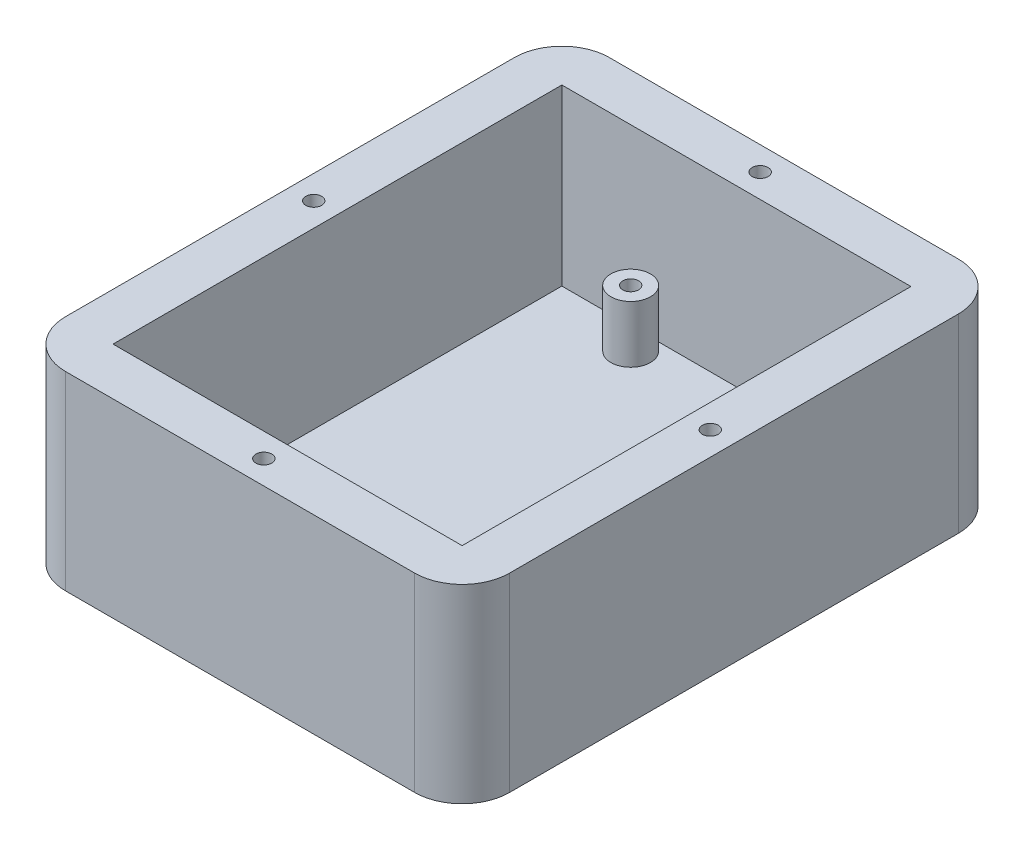
ISO-10303-21;
HEADER;
FILE_DESCRIPTION(('STEP AP214'),'2;1');
FILE_NAME('part.step','',(''),(''),'','','');
FILE_SCHEMA(('AUTOMOTIVE_DESIGN { 1 0 10303 214 1 1 1 1 }'));
ENDSEC;
DATA;
#1=APPLICATION_CONTEXT('core data for automotive mechanical design processes');
#2=APPLICATION_PROTOCOL_DEFINITION('international standard','automotive_design',2000,#1);
#3=PRODUCT_CONTEXT('',#1,'mechanical');
#4=PRODUCT('Part','Part','',(#3));
#5=PRODUCT_RELATED_PRODUCT_CATEGORY('part','',(#4));
#6=PRODUCT_DEFINITION_FORMATION('','',#4);
#7=PRODUCT_DEFINITION_CONTEXT('part definition',#1,'design');
#8=PRODUCT_DEFINITION('design','',#6,#7);
#9=PRODUCT_DEFINITION_SHAPE('','',#8);
#10=(LENGTH_UNIT() NAMED_UNIT(*) SI_UNIT(.MILLI.,.METRE.));
#11=(NAMED_UNIT(*) PLANE_ANGLE_UNIT() SI_UNIT($,.RADIAN.));
#12=(NAMED_UNIT(*) SI_UNIT($,.STERADIAN.) SOLID_ANGLE_UNIT());
#13=UNCERTAINTY_MEASURE_WITH_UNIT(LENGTH_MEASURE(1.E-05),#10,'distance_accuracy_value','');
#14=(GEOMETRIC_REPRESENTATION_CONTEXT(3) GLOBAL_UNCERTAINTY_ASSIGNED_CONTEXT((#13)) GLOBAL_UNIT_ASSIGNED_CONTEXT((#10,
#11,#12)) REPRESENTATION_CONTEXT('',''));
#15=CARTESIAN_POINT('',(0.,0.,0.));
#16=DIRECTION('',(0.,0.,1.));
#17=DIRECTION('',(1.,0.,0.));
#18=AXIS2_PLACEMENT_3D('',#15,#16,#17);
#19=CARTESIAN_POINT('',(3.175,38.1,-3.175));
#20=DIRECTION('',(0.,-1.,0.));
#21=DIRECTION('',(0.,0.,-1.));
#22=AXIS2_PLACEMENT_3D('',#19,#20,#21);
#23=PLANE('',#22);
#24=CARTESIAN_POINT('',(-1.5875,38.1,-48.175000043));
#25=DIRECTION('',(0.,1.,0.));
#26=DIRECTION('',(0.,0.,1.));
#27=AXIS2_PLACEMENT_3D('',#24,#25,#26);
#28=CIRCLE('',#27,1.5875);
#29=CARTESIAN_POINT('',(-1.5875,38.1,-46.587500043));
#30=VERTEX_POINT('',#29);
#31=EDGE_CURVE('E163',#30,#30,#28,.T.);
#32=ORIENTED_EDGE('',*,*,#31,.F.);
#33=EDGE_LOOP('',(#32));
#34=FACE_BOUND('',#33,.T.);
#35=CARTESIAN_POINT('',(38.174999977,38.1,-97.937500086));
#36=DIRECTION('',(0.,1.,0.));
#37=DIRECTION('',(0.,0.,1.));
#38=AXIS2_PLACEMENT_3D('',#35,#36,#37);
#39=CIRCLE('',#38,1.5875);
#40=CARTESIAN_POINT('',(38.174999977,38.1,-96.350000086));
#41=VERTEX_POINT('',#40);
#42=EDGE_CURVE('E589',#41,#41,#39,.T.);
#43=ORIENTED_EDGE('',*,*,#42,.F.);
#44=EDGE_LOOP('',(#43));
#45=FACE_BOUND('',#44,.T.);
#46=CARTESIAN_POINT('',(38.174999977,38.1,1.58750000000001));
#47=DIRECTION('',(0.,1.,0.));
#48=DIRECTION('',(0.,0.,-1.));
#49=AXIS2_PLACEMENT_3D('',#46,#47,#48);
#50=CIRCLE('',#49,1.5875);
#51=CARTESIAN_POINT('',(38.174999977,38.1,0.));
#52=VERTEX_POINT('',#51);
#53=EDGE_CURVE('E595',#52,#52,#50,.T.);
#54=ORIENTED_EDGE('',*,*,#53,.F.);
#55=EDGE_LOOP('',(#54));
#56=FACE_BOUND('',#55,.T.);
#57=CARTESIAN_POINT('',(77.937499954,38.1,-48.175000043));
#58=DIRECTION('',(0.,1.,0.));
#59=DIRECTION('',(0.,0.,-1.));
#60=AXIS2_PLACEMENT_3D('',#57,#58,#59);
#61=CIRCLE('',#60,1.5875);
#62=CARTESIAN_POINT('',(77.937499954,38.1,-49.762500043));
#63=VERTEX_POINT('',#62);
#64=EDGE_CURVE('E571',#63,#63,#61,.T.);
#65=ORIENTED_EDGE('',*,*,#64,.F.);
#66=EDGE_LOOP('',(#65));
#67=FACE_BOUND('',#66,.T.);
#68=DIRECTION('',(0.,0.,-1.));
#69=VECTOR('',#68,1.);
#70=CARTESIAN_POINT('',(73.174999954,38.1,-3.175));
#71=LINE('',#70,#69);
#72=CARTESIAN_POINT('',(73.174999954,38.1,-3.175));
#73=VERTEX_POINT('',#72);
#74=CARTESIAN_POINT('',(73.174999954,38.1,-93.175000086));
#75=VERTEX_POINT('',#74);
#76=EDGE_CURVE('E216',#73,#75,#71,.T.);
#77=ORIENTED_EDGE('',*,*,#76,.F.);
#78=DIRECTION('',(1.,0.,0.));
#79=VECTOR('',#78,1.);
#80=CARTESIAN_POINT('',(3.175,38.1,-3.175));
#81=LINE('',#80,#79);
#82=CARTESIAN_POINT('',(3.175,38.1,-3.175));
#83=VERTEX_POINT('',#82);
#84=EDGE_CURVE('E219',#83,#73,#81,.T.);
#85=ORIENTED_EDGE('',*,*,#84,.F.);
#86=DIRECTION('',(0.,0.,1.));
#87=VECTOR('',#86,1.);
#88=CARTESIAN_POINT('',(3.175,38.1,-93.175000086));
#89=LINE('',#88,#87);
#90=CARTESIAN_POINT('',(3.175,38.1,-93.175000086));
#91=VERTEX_POINT('',#90);
#92=EDGE_CURVE('E214',#91,#83,#89,.T.);
#93=ORIENTED_EDGE('',*,*,#92,.F.);
#94=DIRECTION('',(-1.,0.,0.));
#95=VECTOR('',#94,1.);
#96=CARTESIAN_POINT('',(73.174999954,38.1,-93.175000086));
#97=LINE('',#96,#95);
#98=EDGE_CURVE('E51',#75,#91,#97,.T.);
#99=ORIENTED_EDGE('',*,*,#98,.F.);
#100=EDGE_LOOP('',(#77,#85,#93,#99));
#101=FACE_BOUND('',#100,.T.);
#102=CARTESIAN_POINT('',(3.175,38.1,-3.175));
#103=DIRECTION('',(0.,-1.,0.));
#104=DIRECTION('',(0.,0.,-1.));
#105=AXIS2_PLACEMENT_3D('',#102,#103,#104);
#106=CIRCLE('',#105,9.525);
#107=CARTESIAN_POINT('',(-6.35,38.1,-3.17500000000007));
#108=VERTEX_POINT('',#107);
#109=CARTESIAN_POINT('',(3.17500000000007,38.1,6.35));
#110=VERTEX_POINT('',#109);
#111=EDGE_CURVE('E143',#108,#110,#106,.F.);
#112=ORIENTED_EDGE('',*,*,#111,.T.);
#113=DIRECTION('',(1.,0.,0.));
#114=VECTOR('',#113,1.);
#115=CARTESIAN_POINT('',(73.1749999539999,38.1,6.35));
#116=LINE('',#115,#114);
#117=CARTESIAN_POINT('',(73.1749999539999,38.1,6.35));
#118=VERTEX_POINT('',#117);
#119=EDGE_CURVE('E609',#110,#118,#116,.T.);
#120=ORIENTED_EDGE('',*,*,#119,.T.);
#121=CARTESIAN_POINT('',(73.174999954,38.1,-3.175));
#122=DIRECTION('',(0.,-1.,0.));
#123=DIRECTION('',(0.,0.,-1.));
#124=AXIS2_PLACEMENT_3D('',#121,#122,#123);
#125=CIRCLE('',#124,9.525);
#126=CARTESIAN_POINT('',(82.699999954,38.1,-3.17500000000003));
#127=VERTEX_POINT('',#126);
#128=EDGE_CURVE('E608',#118,#127,#125,.F.);
#129=ORIENTED_EDGE('',*,*,#128,.T.);
#130=DIRECTION('',(0.,0.,-1.));
#131=VECTOR('',#130,1.);
#132=CARTESIAN_POINT('',(82.699999954,38.1,-93.1750000859999));
#133=LINE('',#132,#131);
#134=CARTESIAN_POINT('',(82.699999954,38.1,-93.1750000859999));
#135=VERTEX_POINT('',#134);
#136=EDGE_CURVE('E606',#127,#135,#133,.T.);
#137=ORIENTED_EDGE('',*,*,#136,.T.);
#138=CARTESIAN_POINT('',(73.174999954,38.1,-93.175000086));
#139=DIRECTION('',(0.,-1.,0.));
#140=DIRECTION('',(0.,0.,-1.));
#141=AXIS2_PLACEMENT_3D('',#138,#139,#140);
#142=CIRCLE('',#141,9.52499999999999);
#143=CARTESIAN_POINT('',(73.174999954,38.1,-102.700000086));
#144=VERTEX_POINT('',#143);
#145=EDGE_CURVE('E604',#135,#144,#142,.F.);
#146=ORIENTED_EDGE('',*,*,#145,.T.);
#147=DIRECTION('',(-1.,0.,0.));
#148=VECTOR('',#147,1.);
#149=CARTESIAN_POINT('',(3.17500000000007,38.1,-102.700000086));
#150=LINE('',#149,#148);
#151=CARTESIAN_POINT('',(3.175,38.1,-102.700000086));
#152=VERTEX_POINT('',#151);
#153=EDGE_CURVE('E602',#144,#152,#150,.T.);
#154=ORIENTED_EDGE('',*,*,#153,.T.);
#155=CARTESIAN_POINT('',(3.175,38.1,-93.175000086));
#156=DIRECTION('',(0.,-1.,0.));
#157=DIRECTION('',(0.,0.,-1.));
#158=AXIS2_PLACEMENT_3D('',#155,#156,#157);
#159=CIRCLE('',#158,9.525);
#160=CARTESIAN_POINT('',(-6.35,38.1,-93.175000086));
#161=VERTEX_POINT('',#160);
#162=EDGE_CURVE('E183',#152,#161,#159,.F.);
#163=ORIENTED_EDGE('',*,*,#162,.T.);
#164=DIRECTION('',(0.,0.,1.));
#165=VECTOR('',#164,1.);
#166=CARTESIAN_POINT('',(-6.35,38.1,-3.17500000000007));
#167=LINE('',#166,#165);
#168=EDGE_CURVE('E202',#161,#108,#167,.T.);
#169=ORIENTED_EDGE('',*,*,#168,.T.);
#170=EDGE_LOOP('',(#112,#120,#129,#137,#146,#154,#163,#169));
#171=FACE_BOUND('',#170,.T.);
#172=ADVANCED_FACE('F36',(#34,#45,#56,#67,#101,#171),#23,.F.);
#173=CARTESIAN_POINT('',(3.175,3.175,-3.175));
#174=DIRECTION('',(0.,-1.,0.));
#175=DIRECTION('',(0.,0.,-1.));
#176=AXIS2_PLACEMENT_3D('',#173,#174,#175);
#177=PLANE('',#176);
#178=CARTESIAN_POINT('',(68.174999954,3.175,-70.175000043));
#179=DIRECTION('',(0.,1.,0.));
#180=DIRECTION('',(0.,0.,1.));
#181=AXIS2_PLACEMENT_3D('',#178,#179,#180);
#182=CIRCLE('',#181,1.5875);
#183=CARTESIAN_POINT('',(68.174999954,3.175,-68.587500043));
#184=VERTEX_POINT('',#183);
#185=EDGE_CURVE('E567',#184,#184,#182,.T.);
#186=ORIENTED_EDGE('',*,*,#185,.F.);
#187=EDGE_LOOP('',(#186));
#188=FACE_BOUND('',#187,.T.);
#189=CARTESIAN_POINT('',(68.174999954,3.175,-26.175000043));
#190=DIRECTION('',(0.,1.,0.));
#191=DIRECTION('',(0.,0.,1.));
#192=AXIS2_PLACEMENT_3D('',#189,#190,#191);
#193=CIRCLE('',#192,1.5875);
#194=CARTESIAN_POINT('',(68.174999954,3.175,-24.587500043));
#195=VERTEX_POINT('',#194);
#196=EDGE_CURVE('E579',#195,#195,#193,.T.);
#197=ORIENTED_EDGE('',*,*,#196,.F.);
#198=EDGE_LOOP('',(#197));
#199=FACE_BOUND('',#198,.T.);
#200=CARTESIAN_POINT('',(39.704999977,3.175,-8.97500004299999));
#201=DIRECTION('',(0.,-1.,0.));
#202=DIRECTION('',(0.,0.,-1.));
#203=AXIS2_PLACEMENT_3D('',#200,#201,#202);
#204=CIRCLE('',#203,3.96875);
#205=CARTESIAN_POINT('',(39.704999977,3.175,-12.943750043));
#206=VERTEX_POINT('',#205);
#207=EDGE_CURVE('E12',#206,#206,#204,.F.);
#208=ORIENTED_EDGE('',*,*,#207,.F.);
#209=EDGE_LOOP('',(#208));
#210=FACE_BOUND('',#209,.T.);
#211=CARTESIAN_POINT('',(21.371999977,3.175,-88.775000043));
#212=DIRECTION('',(0.,-1.,0.));
#213=DIRECTION('',(0.,0.,-1.));
#214=AXIS2_PLACEMENT_3D('',#211,#212,#213);
#215=CIRCLE('',#214,3.96875);
#216=CARTESIAN_POINT('',(21.371999977,3.175,-92.743750043));
#217=VERTEX_POINT('',#216);
#218=EDGE_CURVE('E44',#217,#217,#215,.F.);
#219=ORIENTED_EDGE('',*,*,#218,.F.);
#220=EDGE_LOOP('',(#219));
#221=FACE_BOUND('',#220,.T.);
#222=DIRECTION('',(0.,0.,1.));
#223=VECTOR('',#222,1.);
#224=CARTESIAN_POINT('',(3.175,3.175,-93.175000086));
#225=LINE('',#224,#223);
#226=CARTESIAN_POINT('',(3.175,3.175,-93.175000086));
#227=VERTEX_POINT('',#226);
#228=CARTESIAN_POINT('',(3.175,3.175,-3.175));
#229=VERTEX_POINT('',#228);
#230=EDGE_CURVE('E224',#227,#229,#225,.T.);
#231=ORIENTED_EDGE('',*,*,#230,.T.);
#232=DIRECTION('',(1.,0.,0.));
#233=VECTOR('',#232,1.);
#234=CARTESIAN_POINT('',(3.175,3.175,-3.175));
#235=LINE('',#234,#233);
#236=CARTESIAN_POINT('',(73.174999954,3.175,-3.175));
#237=VERTEX_POINT('',#236);
#238=EDGE_CURVE('E76',#229,#237,#235,.T.);
#239=ORIENTED_EDGE('',*,*,#238,.T.);
#240=DIRECTION('',(0.,0.,-1.));
#241=VECTOR('',#240,1.);
#242=CARTESIAN_POINT('',(73.174999954,3.175,-3.175));
#243=LINE('',#242,#241);
#244=CARTESIAN_POINT('',(73.174999954,3.175,-93.175000086));
#245=VERTEX_POINT('',#244);
#246=EDGE_CURVE('E84',#237,#245,#243,.T.);
#247=ORIENTED_EDGE('',*,*,#246,.T.);
#248=DIRECTION('',(-1.,0.,0.));
#249=VECTOR('',#248,1.);
#250=CARTESIAN_POINT('',(73.174999954,3.175,-93.175000086));
#251=LINE('',#250,#249);
#252=EDGE_CURVE('E227',#245,#227,#251,.T.);
#253=ORIENTED_EDGE('',*,*,#252,.T.);
#254=EDGE_LOOP('',(#231,#239,#247,#253));
#255=FACE_BOUND('',#254,.T.);
#256=ADVANCED_FACE('F240',(#188,#199,#210,#221,#255),#177,.F.);
#257=CARTESIAN_POINT('',(3.175,-114.017542549557,-3.175));
#258=DIRECTION('',(0.,0.,1.));
#259=DIRECTION('',(1.,0.,0.));
#260=AXIS2_PLACEMENT_3D('',#257,#258,#259);
#261=PLANE('',#260);
#262=DIRECTION('',(0.,1.,0.));
#263=VECTOR('',#262,1.);
#264=CARTESIAN_POINT('',(3.175,-114.017542549557,-3.175));
#265=LINE('',#264,#263);
#266=EDGE_CURVE('E60',#229,#83,#265,.T.);
#267=ORIENTED_EDGE('',*,*,#266,.T.);
#268=ORIENTED_EDGE('',*,*,#84,.T.);
#269=DIRECTION('',(0.,1.,0.));
#270=VECTOR('',#269,1.);
#271=CARTESIAN_POINT('',(73.174999954,-114.017542549557,-3.175));
#272=LINE('',#271,#270);
#273=EDGE_CURVE('E223',#237,#73,#272,.T.);
#274=ORIENTED_EDGE('',*,*,#273,.F.);
#275=ORIENTED_EDGE('',*,*,#238,.F.);
#276=EDGE_LOOP('',(#267,#268,#274,#275));
#277=FACE_BOUND('',#276,.T.);
#278=ADVANCED_FACE('F243',(#277),#261,.F.);
#279=CARTESIAN_POINT('',(73.174999954,-114.017542549557,-3.175));
#280=DIRECTION('',(1.,0.,0.));
#281=DIRECTION('',(0.,0.,-1.));
#282=AXIS2_PLACEMENT_3D('',#279,#280,#281);
#283=PLANE('',#282);
#284=ORIENTED_EDGE('',*,*,#273,.T.);
#285=ORIENTED_EDGE('',*,*,#76,.T.);
#286=DIRECTION('',(0.,1.,0.));
#287=VECTOR('',#286,1.);
#288=CARTESIAN_POINT('',(73.174999954,-114.017542549557,-93.175000086));
#289=LINE('',#288,#287);
#290=EDGE_CURVE('E230',#245,#75,#289,.T.);
#291=ORIENTED_EDGE('',*,*,#290,.F.);
#292=ORIENTED_EDGE('',*,*,#246,.F.);
#293=EDGE_LOOP('',(#284,#285,#291,#292));
#294=FACE_BOUND('',#293,.T.);
#295=ADVANCED_FACE('F255',(#294),#283,.F.);
#296=CARTESIAN_POINT('',(73.174999954,-114.017542549557,-93.175000086));
#297=DIRECTION('',(0.,0.,-1.));
#298=DIRECTION('',(-1.,0.,0.));
#299=AXIS2_PLACEMENT_3D('',#296,#297,#298);
#300=PLANE('',#299);
#301=ORIENTED_EDGE('',*,*,#290,.T.);
#302=ORIENTED_EDGE('',*,*,#98,.T.);
#303=DIRECTION('',(0.,1.,0.));
#304=VECTOR('',#303,1.);
#305=CARTESIAN_POINT('',(3.175,-114.017542549557,-93.175000086));
#306=LINE('',#305,#304);
#307=EDGE_CURVE('E226',#227,#91,#306,.T.);
#308=ORIENTED_EDGE('',*,*,#307,.F.);
#309=ORIENTED_EDGE('',*,*,#252,.F.);
#310=EDGE_LOOP('',(#301,#302,#308,#309));
#311=FACE_BOUND('',#310,.T.);
#312=ADVANCED_FACE('F256',(#311),#300,.F.);
#313=CARTESIAN_POINT('',(3.175,-114.017542549557,-93.175000086));
#314=DIRECTION('',(-1.,0.,0.));
#315=DIRECTION('',(0.,0.,1.));
#316=AXIS2_PLACEMENT_3D('',#313,#314,#315);
#317=PLANE('',#316);
#318=ORIENTED_EDGE('',*,*,#307,.T.);
#319=ORIENTED_EDGE('',*,*,#92,.T.);
#320=ORIENTED_EDGE('',*,*,#266,.F.);
#321=ORIENTED_EDGE('',*,*,#230,.F.);
#322=EDGE_LOOP('',(#318,#319,#320,#321));
#323=FACE_BOUND('',#322,.T.);
#324=ADVANCED_FACE('F249',(#323),#317,.F.);
#325=CARTESIAN_POINT('',(21.371999977,14.605,-88.775000043));
#326=DIRECTION('',(0.,1.,0.));
#327=DIRECTION('',(0.,0.,1.));
#328=AXIS2_PLACEMENT_3D('',#325,#326,#327);
#329=PLANE('',#328);
#330=CARTESIAN_POINT('',(21.371999977,14.605,-88.775000043));
#331=DIRECTION('',(0.,1.,0.));
#332=DIRECTION('',(0.,0.,1.));
#333=AXIS2_PLACEMENT_3D('',#330,#331,#332);
#334=CIRCLE('',#333,3.96875);
#335=CARTESIAN_POINT('',(21.371999977,14.605,-84.806250043));
#336=VERTEX_POINT('',#335);
#337=EDGE_CURVE('E209',#336,#336,#334,.T.);
#338=ORIENTED_EDGE('',*,*,#337,.T.);
#339=EDGE_LOOP('',(#338));
#340=FACE_BOUND('',#339,.T.);
#341=CARTESIAN_POINT('',(21.371999977,14.605,-88.775000043));
#342=DIRECTION('',(0.,1.,0.));
#343=DIRECTION('',(0.,0.,1.));
#344=AXIS2_PLACEMENT_3D('',#341,#342,#343);
#345=CIRCLE('',#344,1.5875);
#346=CARTESIAN_POINT('',(21.371999977,14.605,-87.187500043));
#347=VERTEX_POINT('',#346);
#348=EDGE_CURVE('E206',#347,#347,#345,.T.);
#349=ORIENTED_EDGE('',*,*,#348,.F.);
#350=EDGE_LOOP('',(#349));
#351=FACE_BOUND('',#350,.T.);
#352=ADVANCED_FACE('F263',(#340,#351),#329,.T.);
#353=CARTESIAN_POINT('',(21.371999977,14.605,-88.775000043));
#354=DIRECTION('',(0.,-1.,0.));
#355=DIRECTION('',(0.,0.,-1.));
#356=AXIS2_PLACEMENT_3D('',#353,#354,#355);
#357=CYLINDRICAL_SURFACE('',#356,3.96875);
#358=ORIENTED_EDGE('',*,*,#337,.F.);
#359=EDGE_LOOP('',(#358));
#360=FACE_BOUND('',#359,.T.);
#361=ORIENTED_EDGE('',*,*,#218,.T.);
#362=EDGE_LOOP('',(#361));
#363=FACE_BOUND('',#362,.T.);
#364=ADVANCED_FACE('F238',(#360,#363),#357,.T.);
#365=CARTESIAN_POINT('',(21.371999977,14.605,-88.775000043));
#366=DIRECTION('',(0.,-1.,0.));
#367=DIRECTION('',(0.,0.,-1.));
#368=AXIS2_PLACEMENT_3D('',#365,#366,#367);
#369=CYLINDRICAL_SURFACE('',#368,1.5875);
#370=ORIENTED_EDGE('',*,*,#348,.T.);
#371=EDGE_LOOP('',(#370));
#372=FACE_BOUND('',#371,.T.);
#373=CARTESIAN_POINT('',(21.371999977,3.175,-88.775000043));
#374=DIRECTION('',(0.,1.,0.));
#375=DIRECTION('',(0.,0.,1.));
#376=AXIS2_PLACEMENT_3D('',#373,#374,#375);
#377=CIRCLE('',#376,1.5875);
#378=CARTESIAN_POINT('',(21.371999977,3.175,-87.187500043));
#379=VERTEX_POINT('',#378);
#380=EDGE_CURVE('E205',#379,#379,#377,.T.);
#381=ORIENTED_EDGE('',*,*,#380,.F.);
#382=EDGE_LOOP('',(#381));
#383=FACE_BOUND('',#382,.T.);
#384=ADVANCED_FACE('F312',(#372,#383),#369,.F.);
#385=ORIENTED_EDGE('',*,*,#380,.T.);
#386=EDGE_LOOP('',(#385));
#387=FACE_BOUND('',#386,.T.);
#388=ADVANCED_FACE('F247',(#387),#177,.F.);
#389=CARTESIAN_POINT('',(39.704999977,14.605,-8.97500004299999));
#390=DIRECTION('',(0.,1.,0.));
#391=DIRECTION('',(0.,0.,1.));
#392=AXIS2_PLACEMENT_3D('',#389,#390,#391);
#393=PLANE('',#392);
#394=CARTESIAN_POINT('',(39.704999977,14.605,-8.97500004299999));
#395=DIRECTION('',(0.,1.,0.));
#396=DIRECTION('',(0.,0.,1.));
#397=AXIS2_PLACEMENT_3D('',#394,#395,#396);
#398=CIRCLE('',#397,3.96875);
#399=CARTESIAN_POINT('',(39.704999977,14.605,-5.00625004299999));
#400=VERTEX_POINT('',#399);
#401=EDGE_CURVE('E198',#400,#400,#398,.T.);
#402=ORIENTED_EDGE('',*,*,#401,.T.);
#403=EDGE_LOOP('',(#402));
#404=FACE_BOUND('',#403,.T.);
#405=CARTESIAN_POINT('',(39.704999977,14.605,-8.97500004299999));
#406=DIRECTION('',(0.,1.,0.));
#407=DIRECTION('',(0.,0.,1.));
#408=AXIS2_PLACEMENT_3D('',#405,#406,#407);
#409=CIRCLE('',#408,1.5875);
#410=CARTESIAN_POINT('',(39.704999977,14.605,-7.38750004299999));
#411=VERTEX_POINT('',#410);
#412=EDGE_CURVE('E195',#411,#411,#409,.T.);
#413=ORIENTED_EDGE('',*,*,#412,.F.);
#414=EDGE_LOOP('',(#413));
#415=FACE_BOUND('',#414,.T.);
#416=ADVANCED_FACE('F331',(#404,#415),#393,.T.);
#417=CARTESIAN_POINT('',(39.704999977,14.605,-8.97500004299999));
#418=DIRECTION('',(0.,-1.,0.));
#419=DIRECTION('',(0.,0.,-1.));
#420=AXIS2_PLACEMENT_3D('',#417,#418,#419);
#421=CYLINDRICAL_SURFACE('',#420,3.96875);
#422=ORIENTED_EDGE('',*,*,#401,.F.);
#423=EDGE_LOOP('',(#422));
#424=FACE_BOUND('',#423,.T.);
#425=ORIENTED_EDGE('',*,*,#207,.T.);
#426=EDGE_LOOP('',(#425));
#427=FACE_BOUND('',#426,.T.);
#428=ADVANCED_FACE('F339',(#424,#427),#421,.T.);
#429=CARTESIAN_POINT('',(39.704999977,14.605,-8.97500004299999));
#430=DIRECTION('',(0.,-1.,0.));
#431=DIRECTION('',(0.,0.,-1.));
#432=AXIS2_PLACEMENT_3D('',#429,#430,#431);
#433=CYLINDRICAL_SURFACE('',#432,1.5875);
#434=ORIENTED_EDGE('',*,*,#412,.T.);
#435=EDGE_LOOP('',(#434));
#436=FACE_BOUND('',#435,.T.);
#437=CARTESIAN_POINT('',(39.704999977,3.175,-8.97500004299999));
#438=DIRECTION('',(0.,1.,0.));
#439=DIRECTION('',(0.,0.,1.));
#440=AXIS2_PLACEMENT_3D('',#437,#438,#439);
#441=CIRCLE('',#440,1.5875);
#442=CARTESIAN_POINT('',(39.704999977,3.175,-7.38750004299999));
#443=VERTEX_POINT('',#442);
#444=EDGE_CURVE('E199',#443,#443,#441,.T.);
#445=ORIENTED_EDGE('',*,*,#444,.F.);
#446=EDGE_LOOP('',(#445));
#447=FACE_BOUND('',#446,.T.);
#448=ADVANCED_FACE('F349',(#436,#447),#433,.F.);
#449=ORIENTED_EDGE('',*,*,#444,.T.);
#450=EDGE_LOOP('',(#449));
#451=FACE_BOUND('',#450,.T.);
#452=ADVANCED_FACE('F246',(#451),#177,.F.);
#453=CARTESIAN_POINT('',(-6.35,178.889932205978,-3.17500000000007));
#454=DIRECTION('',(-1.,0.,0.));
#455=DIRECTION('',(0.,0.,1.));
#456=AXIS2_PLACEMENT_3D('',#453,#454,#455);
#457=PLANE('',#456);
#458=ORIENTED_EDGE('',*,*,#168,.F.);
#459=DIRECTION('',(0.,-1.,0.));
#460=VECTOR('',#459,1.);
#461=CARTESIAN_POINT('',(-6.35,178.889932205978,-93.175000086));
#462=LINE('',#461,#460);
#463=CARTESIAN_POINT('',(-6.35,0.,-93.175000086));
#464=VERTEX_POINT('',#463);
#465=EDGE_CURVE('E146',#161,#464,#462,.T.);
#466=ORIENTED_EDGE('',*,*,#465,.T.);
#467=DIRECTION('',(0.,0.,-1.));
#468=VECTOR('',#467,1.);
#469=CARTESIAN_POINT('',(-6.35,0.,-3.17500000000007));
#470=LINE('',#469,#468);
#471=CARTESIAN_POINT('',(-6.35,0.,-3.17500000000007));
#472=VERTEX_POINT('',#471);
#473=EDGE_CURVE('E150',#472,#464,#470,.T.);
#474=ORIENTED_EDGE('',*,*,#473,.F.);
#475=DIRECTION('',(0.,-1.,0.));
#476=VECTOR('',#475,1.);
#477=CARTESIAN_POINT('',(-6.35,178.889932205978,-3.17500000000007));
#478=LINE('',#477,#476);
#479=EDGE_CURVE('E136',#108,#472,#478,.T.);
#480=ORIENTED_EDGE('',*,*,#479,.F.);
#481=EDGE_LOOP('',(#458,#466,#474,#480));
#482=FACE_BOUND('',#481,.T.);
#483=ADVANCED_FACE('F151',(#482),#457,.T.);
#484=CARTESIAN_POINT('',(3.175,178.889932205978,-93.175000086));
#485=DIRECTION('',(0.,-1.,0.));
#486=DIRECTION('',(0.,0.,-1.));
#487=AXIS2_PLACEMENT_3D('',#484,#485,#486);
#488=CYLINDRICAL_SURFACE('',#487,9.525);
#489=ORIENTED_EDGE('',*,*,#162,.F.);
#490=DIRECTION('',(0.,-1.,0.));
#491=VECTOR('',#490,1.);
#492=CARTESIAN_POINT('',(3.17500000000007,178.889932205978,-102.700000086));
#493=LINE('',#492,#491);
#494=CARTESIAN_POINT('',(3.17500000000007,0.,-102.700000086));
#495=VERTEX_POINT('',#494);
#496=EDGE_CURVE('E192',#152,#495,#493,.T.);
#497=ORIENTED_EDGE('',*,*,#496,.T.);
#498=CARTESIAN_POINT('',(3.175,0.,-93.175000086));
#499=DIRECTION('',(0.,-1.,0.));
#500=DIRECTION('',(0.,0.,-1.));
#501=AXIS2_PLACEMENT_3D('',#498,#499,#500);
#502=CIRCLE('',#501,9.525);
#503=EDGE_CURVE('E156',#464,#495,#502,.T.);
#504=ORIENTED_EDGE('',*,*,#503,.F.);
#505=ORIENTED_EDGE('',*,*,#465,.F.);
#506=EDGE_LOOP('',(#489,#497,#504,#505));
#507=FACE_BOUND('',#506,.T.);
#508=ADVANCED_FACE('F376',(#507),#488,.T.);
#509=CARTESIAN_POINT('',(3.17500000000007,178.889932205978,-102.700000086));
#510=DIRECTION('',(0.,0.,-1.));
#511=DIRECTION('',(-1.,0.,0.));
#512=AXIS2_PLACEMENT_3D('',#509,#510,#511);
#513=PLANE('',#512);
#514=ORIENTED_EDGE('',*,*,#153,.F.);
#515=DIRECTION('',(0.,-1.,0.));
#516=VECTOR('',#515,1.);
#517=CARTESIAN_POINT('',(73.174999954,178.889932205978,-102.700000086));
#518=LINE('',#517,#516);
#519=CARTESIAN_POINT('',(73.174999954,0.,-102.700000086));
#520=VERTEX_POINT('',#519);
#521=EDGE_CURVE('E190',#144,#520,#518,.T.);
#522=ORIENTED_EDGE('',*,*,#521,.T.);
#523=DIRECTION('',(1.,0.,0.));
#524=VECTOR('',#523,1.);
#525=CARTESIAN_POINT('',(3.17500000000007,0.,-102.700000086));
#526=LINE('',#525,#524);
#527=EDGE_CURVE('E169',#495,#520,#526,.T.);
#528=ORIENTED_EDGE('',*,*,#527,.F.);
#529=ORIENTED_EDGE('',*,*,#496,.F.);
#530=EDGE_LOOP('',(#514,#522,#528,#529));
#531=FACE_BOUND('',#530,.T.);
#532=ADVANCED_FACE('F385',(#531),#513,.T.);
#533=CARTESIAN_POINT('',(73.174999954,178.889932205978,-93.175000086));
#534=DIRECTION('',(0.,-1.,0.));
#535=DIRECTION('',(0.,0.,-1.));
#536=AXIS2_PLACEMENT_3D('',#533,#534,#535);
#537=CYLINDRICAL_SURFACE('',#536,9.52499999999999);
#538=ORIENTED_EDGE('',*,*,#145,.F.);
#539=DIRECTION('',(0.,-1.,0.));
#540=VECTOR('',#539,1.);
#541=CARTESIAN_POINT('',(82.699999954,178.889932205978,-93.1750000859999));
#542=LINE('',#541,#540);
#543=CARTESIAN_POINT('',(82.699999954,0.,-93.1750000859999));
#544=VERTEX_POINT('',#543);
#545=EDGE_CURVE('E188',#135,#544,#542,.T.);
#546=ORIENTED_EDGE('',*,*,#545,.T.);
#547=CARTESIAN_POINT('',(73.174999954,0.,-93.175000086));
#548=DIRECTION('',(0.,-1.,0.));
#549=DIRECTION('',(0.,0.,-1.));
#550=AXIS2_PLACEMENT_3D('',#547,#548,#549);
#551=CIRCLE('',#550,9.52499999999999);
#552=EDGE_CURVE('E172',#520,#544,#551,.T.);
#553=ORIENTED_EDGE('',*,*,#552,.F.);
#554=ORIENTED_EDGE('',*,*,#521,.F.);
#555=EDGE_LOOP('',(#538,#546,#553,#554));
#556=FACE_BOUND('',#555,.T.);
#557=ADVANCED_FACE('F395',(#556),#537,.T.);
#558=CARTESIAN_POINT('',(82.699999954,178.889932205978,-93.1750000859999));
#559=DIRECTION('',(1.,0.,0.));
#560=DIRECTION('',(0.,0.,-1.));
#561=AXIS2_PLACEMENT_3D('',#558,#559,#560);
#562=PLANE('',#561);
#563=ORIENTED_EDGE('',*,*,#136,.F.);
#564=DIRECTION('',(0.,-1.,0.));
#565=VECTOR('',#564,1.);
#566=CARTESIAN_POINT('',(82.699999954,178.889932205978,-3.17500000000003));
#567=LINE('',#566,#565);
#568=CARTESIAN_POINT('',(82.699999954,0.,-3.17500000000003));
#569=VERTEX_POINT('',#568);
#570=EDGE_CURVE('E186',#127,#569,#567,.T.);
#571=ORIENTED_EDGE('',*,*,#570,.T.);
#572=DIRECTION('',(0.,0.,1.));
#573=VECTOR('',#572,1.);
#574=CARTESIAN_POINT('',(82.699999954,0.,-93.1750000859999));
#575=LINE('',#574,#573);
#576=EDGE_CURVE('E175',#544,#569,#575,.T.);
#577=ORIENTED_EDGE('',*,*,#576,.F.);
#578=ORIENTED_EDGE('',*,*,#545,.F.);
#579=EDGE_LOOP('',(#563,#571,#577,#578));
#580=FACE_BOUND('',#579,.T.);
#581=ADVANCED_FACE('F405',(#580),#562,.T.);
#582=CARTESIAN_POINT('',(73.174999954,178.889932205978,-3.175));
#583=DIRECTION('',(0.,-1.,0.));
#584=DIRECTION('',(0.,0.,-1.));
#585=AXIS2_PLACEMENT_3D('',#582,#583,#584);
#586=CYLINDRICAL_SURFACE('',#585,9.525);
#587=ORIENTED_EDGE('',*,*,#128,.F.);
#588=DIRECTION('',(0.,-1.,0.));
#589=VECTOR('',#588,1.);
#590=CARTESIAN_POINT('',(73.1749999539999,178.889932205978,6.35));
#591=LINE('',#590,#589);
#592=CARTESIAN_POINT('',(73.1749999539999,0.,6.35));
#593=VERTEX_POINT('',#592);
#594=EDGE_CURVE('E184',#118,#593,#591,.T.);
#595=ORIENTED_EDGE('',*,*,#594,.T.);
#596=CARTESIAN_POINT('',(73.174999954,0.,-3.175));
#597=DIRECTION('',(0.,-1.,0.));
#598=DIRECTION('',(0.,0.,-1.));
#599=AXIS2_PLACEMENT_3D('',#596,#597,#598);
#600=CIRCLE('',#599,9.525);
#601=EDGE_CURVE('E178',#569,#593,#600,.T.);
#602=ORIENTED_EDGE('',*,*,#601,.F.);
#603=ORIENTED_EDGE('',*,*,#570,.F.);
#604=EDGE_LOOP('',(#587,#595,#602,#603));
#605=FACE_BOUND('',#604,.T.);
#606=ADVANCED_FACE('F415',(#605),#586,.T.);
#607=CARTESIAN_POINT('',(73.1749999539999,178.889932205978,6.35));
#608=DIRECTION('',(0.,0.,1.));
#609=DIRECTION('',(1.,0.,0.));
#610=AXIS2_PLACEMENT_3D('',#607,#608,#609);
#611=PLANE('',#610);
#612=ORIENTED_EDGE('',*,*,#119,.F.);
#613=DIRECTION('',(0.,-1.,0.));
#614=VECTOR('',#613,1.);
#615=CARTESIAN_POINT('',(3.17500000000007,178.889932205978,6.35));
#616=LINE('',#615,#614);
#617=CARTESIAN_POINT('',(3.17500000000007,0.,6.35));
#618=VERTEX_POINT('',#617);
#619=EDGE_CURVE('E181',#110,#618,#616,.T.);
#620=ORIENTED_EDGE('',*,*,#619,.T.);
#621=DIRECTION('',(-1.,0.,0.));
#622=VECTOR('',#621,1.);
#623=CARTESIAN_POINT('',(73.1749999539999,0.,6.35));
#624=LINE('',#623,#622);
#625=EDGE_CURVE('E147',#593,#618,#624,.T.);
#626=ORIENTED_EDGE('',*,*,#625,.F.);
#627=ORIENTED_EDGE('',*,*,#594,.F.);
#628=EDGE_LOOP('',(#612,#620,#626,#627));
#629=FACE_BOUND('',#628,.T.);
#630=ADVANCED_FACE('F425',(#629),#611,.T.);
#631=CARTESIAN_POINT('',(3.175,178.889932205978,-3.175));
#632=DIRECTION('',(0.,-1.,0.));
#633=DIRECTION('',(0.,0.,-1.));
#634=AXIS2_PLACEMENT_3D('',#631,#632,#633);
#635=CYLINDRICAL_SURFACE('',#634,9.525);
#636=ORIENTED_EDGE('',*,*,#111,.F.);
#637=ORIENTED_EDGE('',*,*,#479,.T.);
#638=CARTESIAN_POINT('',(3.175,0.,-3.175));
#639=DIRECTION('',(0.,-1.,0.));
#640=DIRECTION('',(0.,0.,-1.));
#641=AXIS2_PLACEMENT_3D('',#638,#639,#640);
#642=CIRCLE('',#641,9.525);
#643=EDGE_CURVE('E141',#618,#472,#642,.T.);
#644=ORIENTED_EDGE('',*,*,#643,.F.);
#645=ORIENTED_EDGE('',*,*,#619,.F.);
#646=EDGE_LOOP('',(#636,#637,#644,#645));
#647=FACE_BOUND('',#646,.T.);
#648=ADVANCED_FACE('F138',(#647),#635,.T.);
#649=CARTESIAN_POINT('',(3.175,0.,-3.175));
#650=DIRECTION('',(0.,-1.,0.));
#651=DIRECTION('',(0.,0.,-1.));
#652=AXIS2_PLACEMENT_3D('',#649,#650,#651);
#653=PLANE('',#652);
#654=CARTESIAN_POINT('',(68.174999954,0.,-70.175000043));
#655=DIRECTION('',(0.,-1.,0.));
#656=DIRECTION('',(0.,0.,-1.));
#657=AXIS2_PLACEMENT_3D('',#654,#655,#656);
#658=CIRCLE('',#657,1.5875);
#659=CARTESIAN_POINT('',(68.174999954,0.,-71.762500043));
#660=VERTEX_POINT('',#659);
#661=EDGE_CURVE('E570',#660,#660,#658,.F.);
#662=ORIENTED_EDGE('',*,*,#661,.T.);
#663=EDGE_LOOP('',(#662));
#664=FACE_BOUND('',#663,.T.);
#665=CARTESIAN_POINT('',(68.174999954,0.,-26.175000043));
#666=DIRECTION('',(0.,-1.,0.));
#667=DIRECTION('',(0.,0.,-1.));
#668=AXIS2_PLACEMENT_3D('',#665,#666,#667);
#669=CIRCLE('',#668,1.5875);
#670=CARTESIAN_POINT('',(68.174999954,0.,-27.762500043));
#671=VERTEX_POINT('',#670);
#672=EDGE_CURVE('E576',#671,#671,#669,.F.);
#673=ORIENTED_EDGE('',*,*,#672,.T.);
#674=EDGE_LOOP('',(#673));
#675=FACE_BOUND('',#674,.T.);
#676=ORIENTED_EDGE('',*,*,#643,.T.);
#677=ORIENTED_EDGE('',*,*,#473,.T.);
#678=ORIENTED_EDGE('',*,*,#503,.T.);
#679=ORIENTED_EDGE('',*,*,#527,.T.);
#680=ORIENTED_EDGE('',*,*,#552,.T.);
#681=ORIENTED_EDGE('',*,*,#576,.T.);
#682=ORIENTED_EDGE('',*,*,#601,.T.);
#683=ORIENTED_EDGE('',*,*,#625,.T.);
#684=EDGE_LOOP('',(#676,#677,#678,#679,#680,#681,#682,#683));
#685=FACE_BOUND('',#684,.T.);
#686=ADVANCED_FACE('F38',(#664,#675,#685),#653,.T.);
#687=CARTESIAN_POINT('',(77.937499954,25.4,-48.175000043));
#688=DIRECTION('',(0.,1.,0.));
#689=DIRECTION('',(0.,0.,1.));
#690=AXIS2_PLACEMENT_3D('',#687,#688,#689);
#691=CYLINDRICAL_SURFACE('',#690,1.5875);
#692=CARTESIAN_POINT('',(77.937499954,25.4,-48.175000043));
#693=DIRECTION('',(0.,1.,0.));
#694=DIRECTION('',(0.,0.,-1.));
#695=AXIS2_PLACEMENT_3D('',#692,#693,#694);
#696=CIRCLE('',#695,1.5875);
#697=CARTESIAN_POINT('',(77.937499954,25.4,-49.762500043));
#698=VERTEX_POINT('',#697);
#699=EDGE_CURVE('E574',#698,#698,#696,.T.);
#700=ORIENTED_EDGE('',*,*,#699,.F.);
#701=EDGE_LOOP('',(#700));
#702=FACE_BOUND('',#701,.T.);
#703=ORIENTED_EDGE('',*,*,#64,.T.);
#704=EDGE_LOOP('',(#703));
#705=FACE_BOUND('',#704,.T.);
#706=ADVANCED_FACE('F454',(#702,#705),#691,.F.);
#707=CARTESIAN_POINT('',(77.937499954,25.4,-48.175000043));
#708=DIRECTION('',(0.,-1.,0.));
#709=DIRECTION('',(0.,0.,-1.));
#710=AXIS2_PLACEMENT_3D('',#707,#708,#709);
#711=PLANE('',#710);
#712=ORIENTED_EDGE('',*,*,#699,.T.);
#713=EDGE_LOOP('',(#712));
#714=FACE_BOUND('',#713,.T.);
#715=ADVANCED_FACE('F459',(#714),#711,.F.);
#716=CARTESIAN_POINT('',(38.174999977,25.4,1.58750000000001));
#717=DIRECTION('',(0.,1.,0.));
#718=DIRECTION('',(0.,0.,1.));
#719=AXIS2_PLACEMENT_3D('',#716,#717,#718);
#720=CYLINDRICAL_SURFACE('',#719,1.5875);
#721=CARTESIAN_POINT('',(38.174999977,25.4,1.58750000000001));
#722=DIRECTION('',(0.,1.,0.));
#723=DIRECTION('',(0.,0.,-1.));
#724=AXIS2_PLACEMENT_3D('',#721,#722,#723);
#725=CIRCLE('',#724,1.5875);
#726=CARTESIAN_POINT('',(38.174999977,25.4,0.));
#727=VERTEX_POINT('',#726);
#728=EDGE_CURVE('E592',#727,#727,#725,.T.);
#729=ORIENTED_EDGE('',*,*,#728,.F.);
#730=EDGE_LOOP('',(#729));
#731=FACE_BOUND('',#730,.T.);
#732=ORIENTED_EDGE('',*,*,#53,.T.);
#733=EDGE_LOOP('',(#732));
#734=FACE_BOUND('',#733,.T.);
#735=ADVANCED_FACE('F469',(#731,#734),#720,.F.);
#736=CARTESIAN_POINT('',(38.174999977,25.4,1.58750000000001));
#737=DIRECTION('',(0.,-1.,0.));
#738=DIRECTION('',(0.,0.,-1.));
#739=AXIS2_PLACEMENT_3D('',#736,#737,#738);
#740=PLANE('',#739);
#741=ORIENTED_EDGE('',*,*,#728,.T.);
#742=EDGE_LOOP('',(#741));
#743=FACE_BOUND('',#742,.T.);
#744=ADVANCED_FACE('F479',(#743),#740,.F.);
#745=CARTESIAN_POINT('',(38.174999977,25.4,-97.937500086));
#746=DIRECTION('',(0.,1.,0.));
#747=DIRECTION('',(0.,0.,1.));
#748=AXIS2_PLACEMENT_3D('',#745,#746,#747);
#749=CYLINDRICAL_SURFACE('',#748,1.5875);
#750=CARTESIAN_POINT('',(38.174999977,25.4,-97.937500086));
#751=DIRECTION('',(0.,1.,0.));
#752=DIRECTION('',(0.,0.,1.));
#753=AXIS2_PLACEMENT_3D('',#750,#751,#752);
#754=CIRCLE('',#753,1.5875);
#755=CARTESIAN_POINT('',(38.174999977,25.4,-96.350000086));
#756=VERTEX_POINT('',#755);
#757=EDGE_CURVE('E586',#756,#756,#754,.T.);
#758=ORIENTED_EDGE('',*,*,#757,.F.);
#759=EDGE_LOOP('',(#758));
#760=FACE_BOUND('',#759,.T.);
#761=ORIENTED_EDGE('',*,*,#42,.T.);
#762=EDGE_LOOP('',(#761));
#763=FACE_BOUND('',#762,.T.);
#764=ADVANCED_FACE('F489',(#760,#763),#749,.F.);
#765=CARTESIAN_POINT('',(38.174999977,25.4,-97.937500086));
#766=DIRECTION('',(0.,1.,0.));
#767=DIRECTION('',(0.,0.,1.));
#768=AXIS2_PLACEMENT_3D('',#765,#766,#767);
#769=PLANE('',#768);
#770=ORIENTED_EDGE('',*,*,#757,.T.);
#771=EDGE_LOOP('',(#770));
#772=FACE_BOUND('',#771,.T.);
#773=ADVANCED_FACE('F499',(#772),#769,.T.);
#774=CARTESIAN_POINT('',(-1.5875,25.4,-48.175000043));
#775=DIRECTION('',(0.,1.,0.));
#776=DIRECTION('',(0.,0.,1.));
#777=AXIS2_PLACEMENT_3D('',#774,#775,#776);
#778=CYLINDRICAL_SURFACE('',#777,1.5875);
#779=CARTESIAN_POINT('',(-1.5875,25.4,-48.175000043));
#780=DIRECTION('',(0.,1.,0.));
#781=DIRECTION('',(0.,0.,1.));
#782=AXIS2_PLACEMENT_3D('',#779,#780,#781);
#783=CIRCLE('',#782,1.5875);
#784=CARTESIAN_POINT('',(-1.5875,25.4,-46.587500043));
#785=VERTEX_POINT('',#784);
#786=EDGE_CURVE('E160',#785,#785,#783,.T.);
#787=ORIENTED_EDGE('',*,*,#786,.F.);
#788=EDGE_LOOP('',(#787));
#789=FACE_BOUND('',#788,.T.);
#790=ORIENTED_EDGE('',*,*,#31,.T.);
#791=EDGE_LOOP('',(#790));
#792=FACE_BOUND('',#791,.T.);
#793=ADVANCED_FACE('F509',(#789,#792),#778,.F.);
#794=CARTESIAN_POINT('',(-1.5875,25.4,-48.175000043));
#795=DIRECTION('',(0.,1.,0.));
#796=DIRECTION('',(0.,0.,1.));
#797=AXIS2_PLACEMENT_3D('',#794,#795,#796);
#798=PLANE('',#797);
#799=ORIENTED_EDGE('',*,*,#786,.T.);
#800=EDGE_LOOP('',(#799));
#801=FACE_BOUND('',#800,.T.);
#802=ADVANCED_FACE('F519',(#801),#798,.T.);
#803=CARTESIAN_POINT('',(68.174999954,-4.49012806053458,-26.175000043));
#804=DIRECTION('',(0.,1.,0.));
#805=DIRECTION('',(0.,0.,1.));
#806=AXIS2_PLACEMENT_3D('',#803,#804,#805);
#807=CYLINDRICAL_SURFACE('',#806,1.5875);
#808=ORIENTED_EDGE('',*,*,#196,.T.);
#809=EDGE_LOOP('',(#808));
#810=FACE_BOUND('',#809,.T.);
#811=ORIENTED_EDGE('',*,*,#672,.F.);
#812=EDGE_LOOP('',(#811));
#813=FACE_BOUND('',#812,.T.);
#814=ADVANCED_FACE('F528',(#810,#813),#807,.F.);
#815=CARTESIAN_POINT('',(68.174999954,-4.49012806053458,-70.175000043));
#816=DIRECTION('',(0.,1.,0.));
#817=DIRECTION('',(0.,0.,1.));
#818=AXIS2_PLACEMENT_3D('',#815,#816,#817);
#819=CYLINDRICAL_SURFACE('',#818,1.5875);
#820=ORIENTED_EDGE('',*,*,#185,.T.);
#821=EDGE_LOOP('',(#820));
#822=FACE_BOUND('',#821,.T.);
#823=ORIENTED_EDGE('',*,*,#661,.F.);
#824=EDGE_LOOP('',(#823));
#825=FACE_BOUND('',#824,.T.);
#826=ADVANCED_FACE('F550',(#822,#825),#819,.F.);
#827=CLOSED_SHELL('',(#172,#256,#278,#295,#312,#324,#352,#364,#384,#388,#416,#428,#448,#452,
#483,#508,#532,#557,#581,#606,#630,#648,#686,#706,#715,#735,#744,#764,#773,#793,#802,#814,#826));
#828=MANIFOLD_SOLID_BREP('B2',#827);
#829=ADVANCED_BREP_SHAPE_REPRESENTATION('',(#18,#828),#14);
#830=SHAPE_DEFINITION_REPRESENTATION(#9,#829);
ENDSEC;
END-ISO-10303-21;
